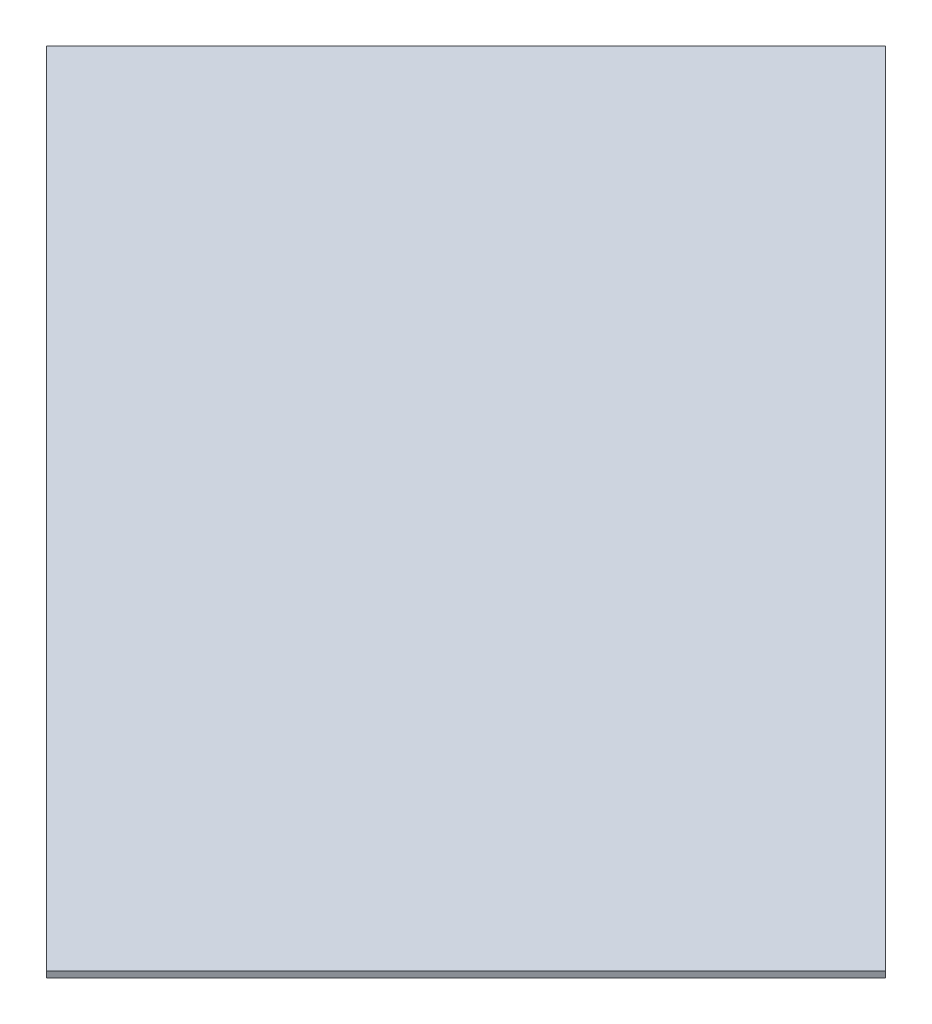
ISO-10303-21;
HEADER;
FILE_DESCRIPTION(('STEP AP214'),'2;1');
FILE_NAME('part.step','',(''),(''),'','','');
FILE_SCHEMA(('AUTOMOTIVE_DESIGN { 1 0 10303 214 1 1 1 1 }'));
ENDSEC;
DATA;
#1=APPLICATION_CONTEXT('core data for automotive mechanical design processes');
#2=APPLICATION_PROTOCOL_DEFINITION('international standard','automotive_design',2000,#1);
#3=PRODUCT_CONTEXT('',#1,'mechanical');
#4=PRODUCT('Part','Part','',(#3));
#5=PRODUCT_RELATED_PRODUCT_CATEGORY('part','',(#4));
#6=PRODUCT_DEFINITION_FORMATION('','',#4);
#7=PRODUCT_DEFINITION_CONTEXT('part definition',#1,'design');
#8=PRODUCT_DEFINITION('design','',#6,#7);
#9=PRODUCT_DEFINITION_SHAPE('','',#8);
#10=(LENGTH_UNIT() NAMED_UNIT(*) SI_UNIT(.MILLI.,.METRE.));
#11=(NAMED_UNIT(*) PLANE_ANGLE_UNIT() SI_UNIT($,.RADIAN.));
#12=(NAMED_UNIT(*) SI_UNIT($,.STERADIAN.) SOLID_ANGLE_UNIT());
#13=UNCERTAINTY_MEASURE_WITH_UNIT(LENGTH_MEASURE(1.E-05),#10,'distance_accuracy_value','');
#14=(GEOMETRIC_REPRESENTATION_CONTEXT(3) GLOBAL_UNCERTAINTY_ASSIGNED_CONTEXT((#13)) GLOBAL_UNIT_ASSIGNED_CONTEXT((#10,
#11,#12)) REPRESENTATION_CONTEXT('',''));
#15=CARTESIAN_POINT('',(0.,0.,0.));
#16=DIRECTION('',(0.,0.,1.));
#17=DIRECTION('',(1.,0.,0.));
#18=AXIS2_PLACEMENT_3D('',#15,#16,#17);
#19=CARTESIAN_POINT('',(45.,10.,0.));
#20=DIRECTION('',(-0.707106781186546,0.,-0.707106781186549));
#21=DIRECTION('',(0.707106781186549,0.,-0.707106781186546));
#22=AXIS2_PLACEMENT_3D('',#19,#20,#21);
#23=PLANE('',#22);
#24=DIRECTION('',(0.,1.,0.));
#25=VECTOR('',#24,1.);
#26=CARTESIAN_POINT('',(45.,10.,0.));
#27=LINE('',#26,#25);
#28=CARTESIAN_POINT('',(45.,10.,0.));
#29=VERTEX_POINT('',#28);
#30=CARTESIAN_POINT('',(45.,10.2,0.));
#31=VERTEX_POINT('',#30);
#32=EDGE_CURVE('E11',#29,#31,#27,.T.);
#33=ORIENTED_EDGE('',*,*,#32,.F.);
#34=DIRECTION('',(0.707106781186549,0.,-0.707106781186546));
#35=VECTOR('',#34,1.);
#36=CARTESIAN_POINT('',(45.,10.,0.));
#37=LINE('',#36,#35);
#38=CARTESIAN_POINT('',(59.1421356237309,10.,-14.142135623731));
#39=VERTEX_POINT('',#38);
#40=EDGE_CURVE('E88',#29,#39,#37,.T.);
#41=ORIENTED_EDGE('',*,*,#40,.T.);
#42=DIRECTION('',(0.,1.,0.));
#43=VECTOR('',#42,1.);
#44=CARTESIAN_POINT('',(59.1421356237309,10.,-14.142135623731));
#45=LINE('',#44,#43);
#46=CARTESIAN_POINT('',(59.1421356237309,10.2,-14.142135623731));
#47=VERTEX_POINT('',#46);
#48=EDGE_CURVE('E43',#39,#47,#45,.T.);
#49=ORIENTED_EDGE('',*,*,#48,.T.);
#50=DIRECTION('',(0.707106781186549,0.,-0.707106781186546));
#51=VECTOR('',#50,1.);
#52=CARTESIAN_POINT('',(45.,10.2,0.));
#53=LINE('',#52,#51);
#54=EDGE_CURVE('E101',#31,#47,#53,.T.);
#55=ORIENTED_EDGE('',*,*,#54,.F.);
#56=EDGE_LOOP('',(#33,#41,#49,#55));
#57=FACE_BOUND('',#56,.T.);
#58=ADVANCED_FACE('F33',(#57),#23,.F.);
#59=CARTESIAN_POINT('',(32.142135623731,10.,-41.142135623731));
#60=DIRECTION('',(-0.707106781186548,0.,0.707106781186547));
#61=DIRECTION('',(-0.707106781186547,0.,-0.707106781186548));
#62=AXIS2_PLACEMENT_3D('',#59,#60,#61);
#63=PLANE('',#62);
#64=ORIENTED_EDGE('',*,*,#48,.F.);
#65=DIRECTION('',(-0.707106781186547,0.,-0.707106781186548));
#66=VECTOR('',#65,1.);
#67=CARTESIAN_POINT('',(32.142135623731,10.,-41.142135623731));
#68=LINE('',#67,#66);
#69=CARTESIAN_POINT('',(32.142135623731,10.,-41.142135623731));
#70=VERTEX_POINT('',#69);
#71=EDGE_CURVE('E95',#39,#70,#68,.T.);
#72=ORIENTED_EDGE('',*,*,#71,.T.);
#73=DIRECTION('',(0.,1.,0.));
#74=VECTOR('',#73,1.);
#75=CARTESIAN_POINT('',(32.142135623731,10.,-41.142135623731));
#76=LINE('',#75,#74);
#77=CARTESIAN_POINT('',(32.142135623731,10.2,-41.142135623731));
#78=VERTEX_POINT('',#77);
#79=EDGE_CURVE('E51',#70,#78,#76,.T.);
#80=ORIENTED_EDGE('',*,*,#79,.T.);
#81=DIRECTION('',(-0.707106781186547,0.,-0.707106781186548));
#82=VECTOR('',#81,1.);
#83=CARTESIAN_POINT('',(32.142135623731,10.2,-41.142135623731));
#84=LINE('',#83,#82);
#85=EDGE_CURVE('E82',#47,#78,#84,.T.);
#86=ORIENTED_EDGE('',*,*,#85,.F.);
#87=EDGE_LOOP('',(#64,#72,#80,#86));
#88=FACE_BOUND('',#87,.T.);
#89=ADVANCED_FACE('F105',(#88),#63,.F.);
#90=CARTESIAN_POINT('',(-4.5,10.,-4.5));
#91=DIRECTION('',(-0.707106781186548,0.,-0.707106781186548));
#92=DIRECTION('',(0.707106781186548,0.,-0.707106781186548));
#93=AXIS2_PLACEMENT_3D('',#90,#91,#92);
#94=PLANE('',#93);
#95=ORIENTED_EDGE('',*,*,#79,.F.);
#96=DIRECTION('',(0.707106781186548,0.,-0.707106781186548));
#97=VECTOR('',#96,1.);
#98=CARTESIAN_POINT('',(-4.5,10.,-4.5));
#99=LINE('',#98,#97);
#100=CARTESIAN_POINT('',(18.,10.,-27.));
#101=VERTEX_POINT('',#100);
#102=EDGE_CURVE('E87',#101,#70,#99,.T.);
#103=ORIENTED_EDGE('',*,*,#102,.F.);
#104=DIRECTION('',(0.,1.,0.));
#105=VECTOR('',#104,1.);
#106=CARTESIAN_POINT('',(18.,10.,-27.));
#107=LINE('',#106,#105);
#108=CARTESIAN_POINT('',(18.,10.2,-27.));
#109=VERTEX_POINT('',#108);
#110=EDGE_CURVE('E37',#101,#109,#107,.T.);
#111=ORIENTED_EDGE('',*,*,#110,.T.);
#112=DIRECTION('',(0.707106781186548,0.,-0.707106781186548));
#113=VECTOR('',#112,1.);
#114=CARTESIAN_POINT('',(-4.5,10.2,-4.5));
#115=LINE('',#114,#113);
#116=EDGE_CURVE('E97',#109,#78,#115,.T.);
#117=ORIENTED_EDGE('',*,*,#116,.T.);
#118=EDGE_LOOP('',(#95,#103,#111,#117));
#119=FACE_BOUND('',#118,.T.);
#120=ADVANCED_FACE('F90',(#119),#94,.T.);
#121=CARTESIAN_POINT('',(22.5,10.,-22.5));
#122=DIRECTION('',(0.707106781186547,0.,-0.707106781186548));
#123=DIRECTION('',(0.707106781186548,0.,0.707106781186547));
#124=AXIS2_PLACEMENT_3D('',#121,#122,#123);
#125=PLANE('',#124);
#126=DIRECTION('',(0.707106781186548,0.,0.707106781186547));
#127=VECTOR('',#126,1.);
#128=CARTESIAN_POINT('',(22.5,10.,-22.5));
#129=LINE('',#128,#127);
#130=EDGE_CURVE('E76',#101,#29,#129,.T.);
#131=ORIENTED_EDGE('',*,*,#130,.T.);
#132=ORIENTED_EDGE('',*,*,#32,.T.);
#133=DIRECTION('',(0.707106781186548,0.,0.707106781186547));
#134=VECTOR('',#133,1.);
#135=CARTESIAN_POINT('',(22.5,10.2,-22.5));
#136=LINE('',#135,#134);
#137=EDGE_CURVE('E78',#109,#31,#136,.T.);
#138=ORIENTED_EDGE('',*,*,#137,.F.);
#139=ORIENTED_EDGE('',*,*,#110,.F.);
#140=EDGE_LOOP('',(#131,#132,#138,#139));
#141=FACE_BOUND('',#140,.T.);
#142=ADVANCED_FACE('F35',(#141),#125,.F.);
#143=CARTESIAN_POINT('',(0.,10.2,0.));
#144=DIRECTION('',(0.,-1.,0.));
#145=DIRECTION('',(0.,0.,-1.));
#146=AXIS2_PLACEMENT_3D('',#143,#144,#145);
#147=PLANE('',#146);
#148=ORIENTED_EDGE('',*,*,#116,.F.);
#149=ORIENTED_EDGE('',*,*,#137,.T.);
#150=ORIENTED_EDGE('',*,*,#54,.T.);
#151=ORIENTED_EDGE('',*,*,#85,.T.);
#152=EDGE_LOOP('',(#148,#149,#150,#151));
#153=FACE_BOUND('',#152,.T.);
#154=ADVANCED_FACE('F104',(#153),#147,.F.);
#155=CARTESIAN_POINT('',(0.,10.,0.));
#156=DIRECTION('',(0.,-1.,0.));
#157=DIRECTION('',(0.,0.,-1.));
#158=AXIS2_PLACEMENT_3D('',#155,#156,#157);
#159=PLANE('',#158);
#160=ORIENTED_EDGE('',*,*,#102,.T.);
#161=ORIENTED_EDGE('',*,*,#71,.F.);
#162=ORIENTED_EDGE('',*,*,#40,.F.);
#163=ORIENTED_EDGE('',*,*,#130,.F.);
#164=EDGE_LOOP('',(#160,#161,#162,#163));
#165=FACE_BOUND('',#164,.T.);
#166=ADVANCED_FACE('F85',(#165),#159,.T.);
#167=CLOSED_SHELL('',(#58,#89,#120,#142,#154,#166));
#168=MANIFOLD_SOLID_BREP('B2',#167);
#169=ADVANCED_BREP_SHAPE_REPRESENTATION('',(#18,#168),#14);
#170=SHAPE_DEFINITION_REPRESENTATION(#9,#169);
ENDSEC;
END-ISO-10303-21;
